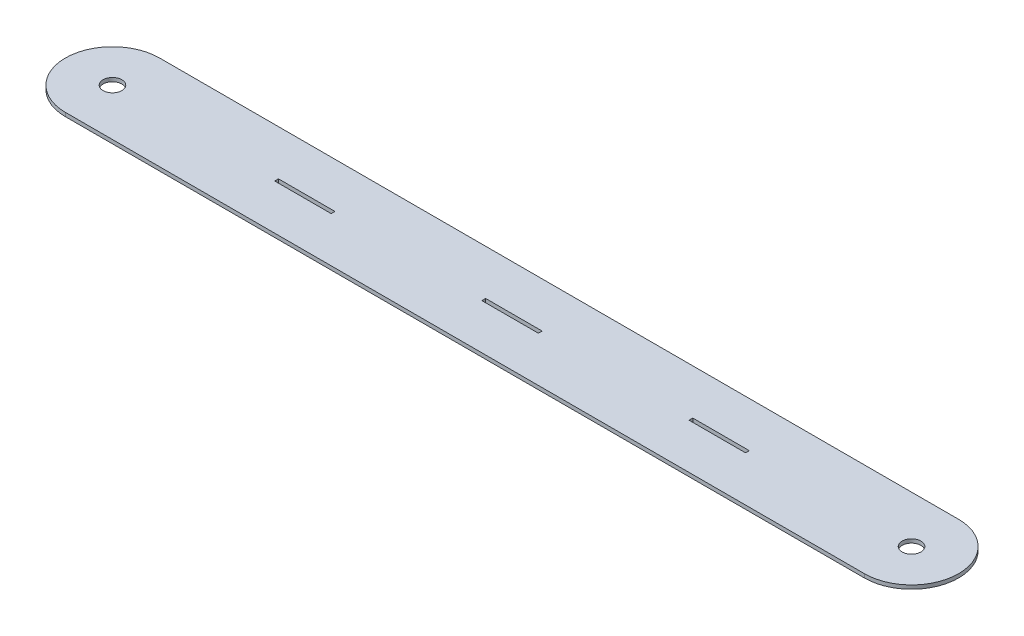
ISO-10303-21;
HEADER;
FILE_DESCRIPTION(('STEP AP214'),'2;1');
FILE_NAME('part.step','',(''),(''),'','','');
FILE_SCHEMA(('AUTOMOTIVE_DESIGN { 1 0 10303 214 1 1 1 1 }'));
ENDSEC;
DATA;
#1=APPLICATION_CONTEXT('core data for automotive mechanical design processes');
#2=APPLICATION_PROTOCOL_DEFINITION('international standard','automotive_design',2000,#1);
#3=PRODUCT_CONTEXT('',#1,'mechanical');
#4=PRODUCT('Part','Part','',(#3));
#5=PRODUCT_RELATED_PRODUCT_CATEGORY('part','',(#4));
#6=PRODUCT_DEFINITION_FORMATION('','',#4);
#7=PRODUCT_DEFINITION_CONTEXT('part definition',#1,'design');
#8=PRODUCT_DEFINITION('design','',#6,#7);
#9=PRODUCT_DEFINITION_SHAPE('','',#8);
#10=(LENGTH_UNIT() NAMED_UNIT(*) SI_UNIT(.MILLI.,.METRE.));
#11=(NAMED_UNIT(*) PLANE_ANGLE_UNIT() SI_UNIT($,.RADIAN.));
#12=(NAMED_UNIT(*) SI_UNIT($,.STERADIAN.) SOLID_ANGLE_UNIT());
#13=UNCERTAINTY_MEASURE_WITH_UNIT(LENGTH_MEASURE(1.E-05),#10,'distance_accuracy_value','');
#14=(GEOMETRIC_REPRESENTATION_CONTEXT(3) GLOBAL_UNCERTAINTY_ASSIGNED_CONTEXT((#13)) GLOBAL_UNIT_ASSIGNED_CONTEXT((#10,
#11,#12)) REPRESENTATION_CONTEXT('',''));
#15=CARTESIAN_POINT('',(0.,0.,0.));
#16=DIRECTION('',(0.,0.,1.));
#17=DIRECTION('',(1.,0.,0.));
#18=AXIS2_PLACEMENT_3D('',#15,#16,#17);
#19=CARTESIAN_POINT('',(0.,1.,0.));
#20=DIRECTION('',(0.,1.,0.));
#21=DIRECTION('',(0.,0.,1.));
#22=AXIS2_PLACEMENT_3D('',#19,#20,#21);
#23=PLANE('',#22);
#24=CARTESIAN_POINT('',(0.,1.,0.));
#25=DIRECTION('',(0.,1.,0.));
#26=DIRECTION('',(0.,0.,1.));
#27=AXIS2_PLACEMENT_3D('',#24,#25,#26);
#28=CIRCLE('',#27,2.5);
#29=CARTESIAN_POINT('',(0.,1.,2.5));
#30=VERTEX_POINT('',#29);
#31=EDGE_CURVE('E250',#30,#30,#28,.T.);
#32=ORIENTED_EDGE('',*,*,#31,.F.);
#33=EDGE_LOOP('',(#32));
#34=FACE_BOUND('',#33,.T.);
#35=CARTESIAN_POINT('',(0.,1.,0.));
#36=DIRECTION('',(0.,1.,0.));
#37=DIRECTION('',(0.,0.,1.));
#38=AXIS2_PLACEMENT_3D('',#35,#36,#37);
#39=CIRCLE('',#38,12.5);
#40=CARTESIAN_POINT('',(0.,1.,-12.5));
#41=VERTEX_POINT('',#40);
#42=CARTESIAN_POINT('',(0.,1.,12.5));
#43=VERTEX_POINT('',#42);
#44=EDGE_CURVE('E256',#41,#43,#39,.T.);
#45=ORIENTED_EDGE('',*,*,#44,.T.);
#46=DIRECTION('',(1.,0.,0.));
#47=VECTOR('',#46,1.);
#48=CARTESIAN_POINT('',(0.,1.,12.5));
#49=LINE('',#48,#47);
#50=CARTESIAN_POINT('',(212.132034355964,1.,12.5));
#51=VERTEX_POINT('',#50);
#52=EDGE_CURVE('E259',#43,#51,#49,.T.);
#53=ORIENTED_EDGE('',*,*,#52,.T.);
#54=CARTESIAN_POINT('',(212.132034355964,1.,0.));
#55=DIRECTION('',(0.,1.,0.));
#56=DIRECTION('',(0.,0.,1.));
#57=AXIS2_PLACEMENT_3D('',#54,#55,#56);
#58=CIRCLE('',#57,12.5);
#59=CARTESIAN_POINT('',(212.132034355964,1.,-12.5));
#60=VERTEX_POINT('',#59);
#61=EDGE_CURVE('E262',#51,#60,#58,.T.);
#62=ORIENTED_EDGE('',*,*,#61,.T.);
#63=DIRECTION('',(-1.,0.,0.));
#64=VECTOR('',#63,1.);
#65=CARTESIAN_POINT('',(0.,1.,-12.5));
#66=LINE('',#65,#64);
#67=EDGE_CURVE('E264',#60,#41,#66,.T.);
#68=ORIENTED_EDGE('',*,*,#67,.T.);
#69=EDGE_LOOP('',(#45,#53,#62,#68));
#70=FACE_BOUND('',#69,.T.);
#71=CARTESIAN_POINT('',(212.132034355964,1.,0.));
#72=DIRECTION('',(0.,1.,0.));
#73=DIRECTION('',(0.,0.,1.));
#74=AXIS2_PLACEMENT_3D('',#71,#72,#73);
#75=CIRCLE('',#74,2.50000000000002);
#76=CARTESIAN_POINT('',(212.132034355964,1.,2.50000000000002));
#77=VERTEX_POINT('',#76);
#78=EDGE_CURVE('E244',#77,#77,#75,.T.);
#79=ORIENTED_EDGE('',*,*,#78,.F.);
#80=EDGE_LOOP('',(#79));
#81=FACE_BOUND('',#80,.T.);
#82=DIRECTION('',(-1.,0.,0.));
#83=VECTOR('',#82,1.);
#84=CARTESIAN_POINT('',(98.5660171779821,1.,-0.5));
#85=LINE('',#84,#83);
#86=CARTESIAN_POINT('',(113.566017177982,1.,-0.5));
#87=VERTEX_POINT('',#86);
#88=CARTESIAN_POINT('',(98.5660171779821,1.,-0.5));
#89=VERTEX_POINT('',#88);
#90=EDGE_CURVE('E215',#87,#89,#85,.T.);
#91=ORIENTED_EDGE('',*,*,#90,.F.);
#92=DIRECTION('',(0.,0.,-1.));
#93=VECTOR('',#92,1.);
#94=CARTESIAN_POINT('',(113.566017177982,1.,0.5));
#95=LINE('',#94,#93);
#96=CARTESIAN_POINT('',(113.566017177982,1.,0.5));
#97=VERTEX_POINT('',#96);
#98=EDGE_CURVE('E213',#97,#87,#95,.T.);
#99=ORIENTED_EDGE('',*,*,#98,.F.);
#100=DIRECTION('',(1.,0.,0.));
#101=VECTOR('',#100,1.);
#102=CARTESIAN_POINT('',(98.5660171779821,1.,0.5));
#103=LINE('',#102,#101);
#104=CARTESIAN_POINT('',(98.5660171779821,1.,0.5));
#105=VERTEX_POINT('',#104);
#106=EDGE_CURVE('E221',#105,#97,#103,.T.);
#107=ORIENTED_EDGE('',*,*,#106,.F.);
#108=DIRECTION('',(0.,0.,1.));
#109=VECTOR('',#108,1.);
#110=CARTESIAN_POINT('',(98.5660171779821,1.,0.5));
#111=LINE('',#110,#109);
#112=EDGE_CURVE('E218',#89,#105,#111,.T.);
#113=ORIENTED_EDGE('',*,*,#112,.F.);
#114=EDGE_LOOP('',(#91,#99,#107,#113));
#115=FACE_BOUND('',#114,.T.);
#116=DIRECTION('',(-1.,0.,0.));
#117=VECTOR('',#116,1.);
#118=CARTESIAN_POINT('',(43.5660171779821,1.,-0.5));
#119=LINE('',#118,#117);
#120=CARTESIAN_POINT('',(58.5660171779821,1.,-0.5));
#121=VERTEX_POINT('',#120);
#122=CARTESIAN_POINT('',(43.5660171779821,1.,-0.5));
#123=VERTEX_POINT('',#122);
#124=EDGE_CURVE('E184',#121,#123,#119,.T.);
#125=ORIENTED_EDGE('',*,*,#124,.F.);
#126=DIRECTION('',(0.,0.,-1.));
#127=VECTOR('',#126,1.);
#128=CARTESIAN_POINT('',(58.5660171779821,1.,0.5));
#129=LINE('',#128,#127);
#130=CARTESIAN_POINT('',(58.5660171779821,1.,0.5));
#131=VERTEX_POINT('',#130);
#132=EDGE_CURVE('E182',#131,#121,#129,.T.);
#133=ORIENTED_EDGE('',*,*,#132,.F.);
#134=DIRECTION('',(1.,0.,0.));
#135=VECTOR('',#134,1.);
#136=CARTESIAN_POINT('',(43.5660171779821,1.,0.5));
#137=LINE('',#136,#135);
#138=CARTESIAN_POINT('',(43.5660171779821,1.,0.5));
#139=VERTEX_POINT('',#138);
#140=EDGE_CURVE('E190',#139,#131,#137,.T.);
#141=ORIENTED_EDGE('',*,*,#140,.F.);
#142=DIRECTION('',(0.,0.,1.));
#143=VECTOR('',#142,1.);
#144=CARTESIAN_POINT('',(43.5660171779821,1.,0.5));
#145=LINE('',#144,#143);
#146=EDGE_CURVE('E187',#123,#139,#145,.T.);
#147=ORIENTED_EDGE('',*,*,#146,.F.);
#148=EDGE_LOOP('',(#125,#133,#141,#147));
#149=FACE_BOUND('',#148,.T.);
#150=DIRECTION('',(-1.,0.,0.));
#151=VECTOR('',#150,1.);
#152=CARTESIAN_POINT('',(153.566017177982,1.,-0.5));
#153=LINE('',#152,#151);
#154=CARTESIAN_POINT('',(168.566017177982,1.,-0.5));
#155=VERTEX_POINT('',#154);
#156=CARTESIAN_POINT('',(153.566017177982,1.,-0.5));
#157=VERTEX_POINT('',#156);
#158=EDGE_CURVE('E154',#155,#157,#153,.T.);
#159=ORIENTED_EDGE('',*,*,#158,.F.);
#160=DIRECTION('',(0.,0.,-1.));
#161=VECTOR('',#160,1.);
#162=CARTESIAN_POINT('',(168.566017177982,1.,0.5));
#163=LINE('',#162,#161);
#164=CARTESIAN_POINT('',(168.566017177982,1.,0.5));
#165=VERTEX_POINT('',#164);
#166=EDGE_CURVE('E146',#165,#155,#163,.T.);
#167=ORIENTED_EDGE('',*,*,#166,.F.);
#168=DIRECTION('',(1.,0.,0.));
#169=VECTOR('',#168,1.);
#170=CARTESIAN_POINT('',(153.566017177982,1.,0.5));
#171=LINE('',#170,#169);
#172=CARTESIAN_POINT('',(153.566017177982,1.,0.5));
#173=VERTEX_POINT('',#172);
#174=EDGE_CURVE('E168',#173,#165,#171,.T.);
#175=ORIENTED_EDGE('',*,*,#174,.F.);
#176=DIRECTION('',(0.,0.,1.));
#177=VECTOR('',#176,1.);
#178=CARTESIAN_POINT('',(153.566017177982,1.,0.5));
#179=LINE('',#178,#177);
#180=EDGE_CURVE('E166',#157,#173,#179,.T.);
#181=ORIENTED_EDGE('',*,*,#180,.F.);
#182=EDGE_LOOP('',(#159,#167,#175,#181));
#183=FACE_BOUND('',#182,.T.);
#184=ADVANCED_FACE('F33',(#34,#70,#81,#115,#149,#183),#23,.T.);
#185=CARTESIAN_POINT('',(0.,0.,0.));
#186=DIRECTION('',(0.,1.,0.));
#187=DIRECTION('',(0.,0.,1.));
#188=AXIS2_PLACEMENT_3D('',#185,#186,#187);
#189=PLANE('',#188);
#190=DIRECTION('',(0.,0.,-1.));
#191=VECTOR('',#190,1.);
#192=CARTESIAN_POINT('',(58.5660171779821,0.,0.5));
#193=LINE('',#192,#191);
#194=CARTESIAN_POINT('',(58.5660171779821,0.,0.5));
#195=VERTEX_POINT('',#194);
#196=CARTESIAN_POINT('',(58.5660171779821,0.,-0.5));
#197=VERTEX_POINT('',#196);
#198=EDGE_CURVE('E162',#195,#197,#193,.T.);
#199=ORIENTED_EDGE('',*,*,#198,.T.);
#200=DIRECTION('',(-1.,0.,0.));
#201=VECTOR('',#200,1.);
#202=CARTESIAN_POINT('',(43.5660171779821,0.,-0.5));
#203=LINE('',#202,#201);
#204=CARTESIAN_POINT('',(43.5660171779821,0.,-0.5));
#205=VERTEX_POINT('',#204);
#206=EDGE_CURVE('E195',#197,#205,#203,.T.);
#207=ORIENTED_EDGE('',*,*,#206,.T.);
#208=DIRECTION('',(0.,0.,1.));
#209=VECTOR('',#208,1.);
#210=CARTESIAN_POINT('',(43.5660171779821,0.,0.5));
#211=LINE('',#210,#209);
#212=CARTESIAN_POINT('',(43.5660171779821,0.,0.5));
#213=VERTEX_POINT('',#212);
#214=EDGE_CURVE('E198',#205,#213,#211,.T.);
#215=ORIENTED_EDGE('',*,*,#214,.T.);
#216=DIRECTION('',(1.,0.,0.));
#217=VECTOR('',#216,1.);
#218=CARTESIAN_POINT('',(43.5660171779821,0.,0.5));
#219=LINE('',#218,#217);
#220=EDGE_CURVE('E185',#213,#195,#219,.T.);
#221=ORIENTED_EDGE('',*,*,#220,.T.);
#222=EDGE_LOOP('',(#199,#207,#215,#221));
#223=FACE_BOUND('',#222,.T.);
#224=CARTESIAN_POINT('',(212.132034355964,0.,0.));
#225=DIRECTION('',(0.,1.,0.));
#226=DIRECTION('',(0.,0.,1.));
#227=AXIS2_PLACEMENT_3D('',#224,#225,#226);
#228=CIRCLE('',#227,2.50000000000002);
#229=CARTESIAN_POINT('',(212.132034355964,0.,2.50000000000002));
#230=VERTEX_POINT('',#229);
#231=EDGE_CURVE('E243',#230,#230,#228,.T.);
#232=ORIENTED_EDGE('',*,*,#231,.T.);
#233=EDGE_LOOP('',(#232));
#234=FACE_BOUND('',#233,.T.);
#235=CARTESIAN_POINT('',(0.,0.,0.));
#236=DIRECTION('',(0.,1.,0.));
#237=DIRECTION('',(0.,0.,1.));
#238=AXIS2_PLACEMENT_3D('',#235,#236,#237);
#239=CIRCLE('',#238,2.5);
#240=CARTESIAN_POINT('',(0.,0.,2.5));
#241=VERTEX_POINT('',#240);
#242=EDGE_CURVE('E247',#241,#241,#239,.T.);
#243=ORIENTED_EDGE('',*,*,#242,.T.);
#244=EDGE_LOOP('',(#243));
#245=FACE_BOUND('',#244,.T.);
#246=CARTESIAN_POINT('',(0.,0.,0.));
#247=DIRECTION('',(0.,1.,0.));
#248=DIRECTION('',(0.,0.,1.));
#249=AXIS2_PLACEMENT_3D('',#246,#247,#248);
#250=CIRCLE('',#249,12.5);
#251=CARTESIAN_POINT('',(0.,0.,-12.5));
#252=VERTEX_POINT('',#251);
#253=CARTESIAN_POINT('',(0.,0.,12.5));
#254=VERTEX_POINT('',#253);
#255=EDGE_CURVE('E253',#252,#254,#250,.T.);
#256=ORIENTED_EDGE('',*,*,#255,.F.);
#257=DIRECTION('',(-1.,0.,0.));
#258=VECTOR('',#257,1.);
#259=CARTESIAN_POINT('',(0.,0.,-12.5));
#260=LINE('',#259,#258);
#261=CARTESIAN_POINT('',(212.132034355964,0.,-12.5));
#262=VERTEX_POINT('',#261);
#263=EDGE_CURVE('E260',#262,#252,#260,.T.);
#264=ORIENTED_EDGE('',*,*,#263,.F.);
#265=CARTESIAN_POINT('',(212.132034355964,0.,0.));
#266=DIRECTION('',(0.,1.,0.));
#267=DIRECTION('',(0.,0.,1.));
#268=AXIS2_PLACEMENT_3D('',#265,#266,#267);
#269=CIRCLE('',#268,12.5);
#270=CARTESIAN_POINT('',(212.132034355964,0.,12.5));
#271=VERTEX_POINT('',#270);
#272=EDGE_CURVE('E271',#271,#262,#269,.T.);
#273=ORIENTED_EDGE('',*,*,#272,.F.);
#274=DIRECTION('',(1.,0.,0.));
#275=VECTOR('',#274,1.);
#276=CARTESIAN_POINT('',(0.,0.,12.5));
#277=LINE('',#276,#275);
#278=EDGE_CURVE('E269',#254,#271,#277,.T.);
#279=ORIENTED_EDGE('',*,*,#278,.F.);
#280=EDGE_LOOP('',(#256,#264,#273,#279));
#281=FACE_BOUND('',#280,.T.);
#282=DIRECTION('',(0.,0.,-1.));
#283=VECTOR('',#282,1.);
#284=CARTESIAN_POINT('',(113.566017177982,0.,0.5));
#285=LINE('',#284,#283);
#286=CARTESIAN_POINT('',(113.566017177982,0.,0.5));
#287=VERTEX_POINT('',#286);
#288=CARTESIAN_POINT('',(113.566017177982,0.,-0.5));
#289=VERTEX_POINT('',#288);
#290=EDGE_CURVE('E212',#287,#289,#285,.T.);
#291=ORIENTED_EDGE('',*,*,#290,.T.);
#292=DIRECTION('',(-1.,0.,0.));
#293=VECTOR('',#292,1.);
#294=CARTESIAN_POINT('',(98.5660171779821,0.,-0.5));
#295=LINE('',#294,#293);
#296=CARTESIAN_POINT('',(98.5660171779821,0.,-0.5));
#297=VERTEX_POINT('',#296);
#298=EDGE_CURVE('E226',#289,#297,#295,.T.);
#299=ORIENTED_EDGE('',*,*,#298,.T.);
#300=DIRECTION('',(0.,0.,1.));
#301=VECTOR('',#300,1.);
#302=CARTESIAN_POINT('',(98.5660171779821,0.,0.5));
#303=LINE('',#302,#301);
#304=CARTESIAN_POINT('',(98.5660171779821,0.,0.5));
#305=VERTEX_POINT('',#304);
#306=EDGE_CURVE('E229',#297,#305,#303,.T.);
#307=ORIENTED_EDGE('',*,*,#306,.T.);
#308=DIRECTION('',(1.,0.,0.));
#309=VECTOR('',#308,1.);
#310=CARTESIAN_POINT('',(98.5660171779821,0.,0.5));
#311=LINE('',#310,#309);
#312=EDGE_CURVE('E216',#305,#287,#311,.T.);
#313=ORIENTED_EDGE('',*,*,#312,.T.);
#314=EDGE_LOOP('',(#291,#299,#307,#313));
#315=FACE_BOUND('',#314,.T.);
#316=DIRECTION('',(0.,0.,-1.));
#317=VECTOR('',#316,1.);
#318=CARTESIAN_POINT('',(168.566017177982,0.,0.5));
#319=LINE('',#318,#317);
#320=CARTESIAN_POINT('',(168.566017177982,0.,0.5));
#321=VERTEX_POINT('',#320);
#322=CARTESIAN_POINT('',(168.566017177982,0.,-0.5));
#323=VERTEX_POINT('',#322);
#324=EDGE_CURVE('E56',#321,#323,#319,.T.);
#325=ORIENTED_EDGE('',*,*,#324,.T.);
#326=DIRECTION('',(-1.,0.,0.));
#327=VECTOR('',#326,1.);
#328=CARTESIAN_POINT('',(153.566017177982,0.,-0.5));
#329=LINE('',#328,#327);
#330=CARTESIAN_POINT('',(153.566017177982,0.,-0.5));
#331=VERTEX_POINT('',#330);
#332=EDGE_CURVE('E161',#323,#331,#329,.T.);
#333=ORIENTED_EDGE('',*,*,#332,.T.);
#334=DIRECTION('',(0.,0.,1.));
#335=VECTOR('',#334,1.);
#336=CARTESIAN_POINT('',(153.566017177982,0.,0.5));
#337=LINE('',#336,#335);
#338=CARTESIAN_POINT('',(153.566017177982,0.,0.5));
#339=VERTEX_POINT('',#338);
#340=EDGE_CURVE('E174',#331,#339,#337,.T.);
#341=ORIENTED_EDGE('',*,*,#340,.T.);
#342=DIRECTION('',(1.,0.,0.));
#343=VECTOR('',#342,1.);
#344=CARTESIAN_POINT('',(153.566017177982,0.,0.5));
#345=LINE('',#344,#343);
#346=EDGE_CURVE('E155',#339,#321,#345,.T.);
#347=ORIENTED_EDGE('',*,*,#346,.T.);
#348=EDGE_LOOP('',(#325,#333,#341,#347));
#349=FACE_BOUND('',#348,.T.);
#350=ADVANCED_FACE('F289',(#223,#234,#245,#281,#315,#349),#189,.F.);
#351=CARTESIAN_POINT('',(0.,1.,0.));
#352=DIRECTION('',(0.,-1.,0.));
#353=DIRECTION('',(0.,0.,-1.));
#354=AXIS2_PLACEMENT_3D('',#351,#352,#353);
#355=CYLINDRICAL_SURFACE('',#354,12.5);
#356=ORIENTED_EDGE('',*,*,#255,.T.);
#357=DIRECTION('',(0.,-1.,0.));
#358=VECTOR('',#357,1.);
#359=CARTESIAN_POINT('',(0.,1.,12.5));
#360=LINE('',#359,#358);
#361=EDGE_CURVE('E11',#43,#254,#360,.T.);
#362=ORIENTED_EDGE('',*,*,#361,.F.);
#363=ORIENTED_EDGE('',*,*,#44,.F.);
#364=DIRECTION('',(0.,-1.,0.));
#365=VECTOR('',#364,1.);
#366=CARTESIAN_POINT('',(0.,1.,-12.5));
#367=LINE('',#366,#365);
#368=EDGE_CURVE('E266',#41,#252,#367,.T.);
#369=ORIENTED_EDGE('',*,*,#368,.T.);
#370=EDGE_LOOP('',(#356,#362,#363,#369));
#371=FACE_BOUND('',#370,.T.);
#372=ADVANCED_FACE('F35',(#371),#355,.T.);
#373=CARTESIAN_POINT('',(0.,1.,12.5));
#374=DIRECTION('',(0.,0.,-1.));
#375=DIRECTION('',(-1.,0.,0.));
#376=AXIS2_PLACEMENT_3D('',#373,#374,#375);
#377=PLANE('',#376);
#378=ORIENTED_EDGE('',*,*,#278,.T.);
#379=DIRECTION('',(0.,-1.,0.));
#380=VECTOR('',#379,1.);
#381=CARTESIAN_POINT('',(212.132034355964,1.,12.5));
#382=LINE('',#381,#380);
#383=EDGE_CURVE('E41',#51,#271,#382,.T.);
#384=ORIENTED_EDGE('',*,*,#383,.F.);
#385=ORIENTED_EDGE('',*,*,#52,.F.);
#386=ORIENTED_EDGE('',*,*,#361,.T.);
#387=EDGE_LOOP('',(#378,#384,#385,#386));
#388=FACE_BOUND('',#387,.T.);
#389=ADVANCED_FACE('F300',(#388),#377,.F.);
#390=CARTESIAN_POINT('',(212.132034355964,1.,0.));
#391=DIRECTION('',(0.,-1.,0.));
#392=DIRECTION('',(0.,0.,-1.));
#393=AXIS2_PLACEMENT_3D('',#390,#391,#392);
#394=CYLINDRICAL_SURFACE('',#393,12.5);
#395=ORIENTED_EDGE('',*,*,#272,.T.);
#396=DIRECTION('',(0.,-1.,0.));
#397=VECTOR('',#396,1.);
#398=CARTESIAN_POINT('',(212.132034355964,1.,-12.5));
#399=LINE('',#398,#397);
#400=EDGE_CURVE('E276',#60,#262,#399,.T.);
#401=ORIENTED_EDGE('',*,*,#400,.F.);
#402=ORIENTED_EDGE('',*,*,#61,.F.);
#403=ORIENTED_EDGE('',*,*,#383,.T.);
#404=EDGE_LOOP('',(#395,#401,#402,#403));
#405=FACE_BOUND('',#404,.T.);
#406=ADVANCED_FACE('F283',(#405),#394,.T.);
#407=CARTESIAN_POINT('',(0.,1.,-12.5));
#408=DIRECTION('',(0.,0.,1.));
#409=DIRECTION('',(1.,0.,0.));
#410=AXIS2_PLACEMENT_3D('',#407,#408,#409);
#411=PLANE('',#410);
#412=ORIENTED_EDGE('',*,*,#263,.T.);
#413=ORIENTED_EDGE('',*,*,#368,.F.);
#414=ORIENTED_EDGE('',*,*,#67,.F.);
#415=ORIENTED_EDGE('',*,*,#400,.T.);
#416=EDGE_LOOP('',(#412,#413,#414,#415));
#417=FACE_BOUND('',#416,.T.);
#418=ADVANCED_FACE('F293',(#417),#411,.F.);
#419=CARTESIAN_POINT('',(0.,1.,0.));
#420=DIRECTION('',(0.,-1.,0.));
#421=DIRECTION('',(0.,0.,-1.));
#422=AXIS2_PLACEMENT_3D('',#419,#420,#421);
#423=CYLINDRICAL_SURFACE('',#422,2.5);
#424=ORIENTED_EDGE('',*,*,#31,.T.);
#425=EDGE_LOOP('',(#424));
#426=FACE_BOUND('',#425,.T.);
#427=ORIENTED_EDGE('',*,*,#242,.F.);
#428=EDGE_LOOP('',(#427));
#429=FACE_BOUND('',#428,.T.);
#430=ADVANCED_FACE('F317',(#426,#429),#423,.F.);
#431=CARTESIAN_POINT('',(212.132034355964,1.,0.));
#432=DIRECTION('',(0.,-1.,0.));
#433=DIRECTION('',(0.,0.,-1.));
#434=AXIS2_PLACEMENT_3D('',#431,#432,#433);
#435=CYLINDRICAL_SURFACE('',#434,2.50000000000002);
#436=ORIENTED_EDGE('',*,*,#78,.T.);
#437=EDGE_LOOP('',(#436));
#438=FACE_BOUND('',#437,.T.);
#439=ORIENTED_EDGE('',*,*,#231,.F.);
#440=EDGE_LOOP('',(#439));
#441=FACE_BOUND('',#440,.T.);
#442=ADVANCED_FACE('F324',(#438,#441),#435,.F.);
#443=CARTESIAN_POINT('',(113.566017177982,1.,0.5));
#444=DIRECTION('',(-1.,0.,0.));
#445=DIRECTION('',(0.,0.,1.));
#446=AXIS2_PLACEMENT_3D('',#443,#444,#445);
#447=PLANE('',#446);
#448=ORIENTED_EDGE('',*,*,#290,.F.);
#449=DIRECTION('',(0.,-1.,0.));
#450=VECTOR('',#449,1.);
#451=CARTESIAN_POINT('',(113.566017177982,1.,0.5));
#452=LINE('',#451,#450);
#453=EDGE_CURVE('E223',#97,#287,#452,.T.);
#454=ORIENTED_EDGE('',*,*,#453,.F.);
#455=ORIENTED_EDGE('',*,*,#98,.T.);
#456=DIRECTION('',(0.,-1.,0.));
#457=VECTOR('',#456,1.);
#458=CARTESIAN_POINT('',(113.566017177982,1.,-0.5));
#459=LINE('',#458,#457);
#460=EDGE_CURVE('E240',#87,#289,#459,.T.);
#461=ORIENTED_EDGE('',*,*,#460,.T.);
#462=EDGE_LOOP('',(#448,#454,#455,#461));
#463=FACE_BOUND('',#462,.T.);
#464=ADVANCED_FACE('F329',(#463),#447,.T.);
#465=CARTESIAN_POINT('',(98.5660171779821,1.,-0.5));
#466=DIRECTION('',(0.,0.,1.));
#467=DIRECTION('',(1.,0.,0.));
#468=AXIS2_PLACEMENT_3D('',#465,#466,#467);
#469=PLANE('',#468);
#470=ORIENTED_EDGE('',*,*,#298,.F.);
#471=ORIENTED_EDGE('',*,*,#460,.F.);
#472=ORIENTED_EDGE('',*,*,#90,.T.);
#473=DIRECTION('',(0.,-1.,0.));
#474=VECTOR('',#473,1.);
#475=CARTESIAN_POINT('',(98.5660171779821,1.,-0.5));
#476=LINE('',#475,#474);
#477=EDGE_CURVE('E238',#89,#297,#476,.T.);
#478=ORIENTED_EDGE('',*,*,#477,.T.);
#479=EDGE_LOOP('',(#470,#471,#472,#478));
#480=FACE_BOUND('',#479,.T.);
#481=ADVANCED_FACE('F337',(#480),#469,.T.);
#482=CARTESIAN_POINT('',(98.5660171779821,1.,0.5));
#483=DIRECTION('',(1.,0.,0.));
#484=DIRECTION('',(0.,0.,-1.));
#485=AXIS2_PLACEMENT_3D('',#482,#483,#484);
#486=PLANE('',#485);
#487=ORIENTED_EDGE('',*,*,#306,.F.);
#488=ORIENTED_EDGE('',*,*,#477,.F.);
#489=ORIENTED_EDGE('',*,*,#112,.T.);
#490=DIRECTION('',(0.,-1.,0.));
#491=VECTOR('',#490,1.);
#492=CARTESIAN_POINT('',(98.5660171779821,1.,0.5));
#493=LINE('',#492,#491);
#494=EDGE_CURVE('E236',#105,#305,#493,.T.);
#495=ORIENTED_EDGE('',*,*,#494,.T.);
#496=EDGE_LOOP('',(#487,#488,#489,#495));
#497=FACE_BOUND('',#496,.T.);
#498=ADVANCED_FACE('F344',(#497),#486,.T.);
#499=CARTESIAN_POINT('',(98.5660171779821,1.,0.5));
#500=DIRECTION('',(0.,0.,-1.));
#501=DIRECTION('',(-1.,0.,0.));
#502=AXIS2_PLACEMENT_3D('',#499,#500,#501);
#503=PLANE('',#502);
#504=ORIENTED_EDGE('',*,*,#312,.F.);
#505=ORIENTED_EDGE('',*,*,#494,.F.);
#506=ORIENTED_EDGE('',*,*,#106,.T.);
#507=ORIENTED_EDGE('',*,*,#453,.T.);
#508=EDGE_LOOP('',(#504,#505,#506,#507));
#509=FACE_BOUND('',#508,.T.);
#510=ADVANCED_FACE('F348',(#509),#503,.T.);
#511=CARTESIAN_POINT('',(58.5660171779821,1.,0.5));
#512=DIRECTION('',(-1.,0.,0.));
#513=DIRECTION('',(0.,0.,1.));
#514=AXIS2_PLACEMENT_3D('',#511,#512,#513);
#515=PLANE('',#514);
#516=ORIENTED_EDGE('',*,*,#198,.F.);
#517=DIRECTION('',(0.,-1.,0.));
#518=VECTOR('',#517,1.);
#519=CARTESIAN_POINT('',(58.5660171779821,1.,0.5));
#520=LINE('',#519,#518);
#521=EDGE_CURVE('E192',#131,#195,#520,.T.);
#522=ORIENTED_EDGE('',*,*,#521,.F.);
#523=ORIENTED_EDGE('',*,*,#132,.T.);
#524=DIRECTION('',(0.,-1.,0.));
#525=VECTOR('',#524,1.);
#526=CARTESIAN_POINT('',(58.5660171779821,1.,-0.5));
#527=LINE('',#526,#525);
#528=EDGE_CURVE('E209',#121,#197,#527,.T.);
#529=ORIENTED_EDGE('',*,*,#528,.T.);
#530=EDGE_LOOP('',(#516,#522,#523,#529));
#531=FACE_BOUND('',#530,.T.);
#532=ADVANCED_FACE('F352',(#531),#515,.T.);
#533=CARTESIAN_POINT('',(43.5660171779821,1.,-0.5));
#534=DIRECTION('',(0.,0.,1.));
#535=DIRECTION('',(1.,0.,0.));
#536=AXIS2_PLACEMENT_3D('',#533,#534,#535);
#537=PLANE('',#536);
#538=ORIENTED_EDGE('',*,*,#206,.F.);
#539=ORIENTED_EDGE('',*,*,#528,.F.);
#540=ORIENTED_EDGE('',*,*,#124,.T.);
#541=DIRECTION('',(0.,-1.,0.));
#542=VECTOR('',#541,1.);
#543=CARTESIAN_POINT('',(43.5660171779821,1.,-0.5));
#544=LINE('',#543,#542);
#545=EDGE_CURVE('E207',#123,#205,#544,.T.);
#546=ORIENTED_EDGE('',*,*,#545,.T.);
#547=EDGE_LOOP('',(#538,#539,#540,#546));
#548=FACE_BOUND('',#547,.T.);
#549=ADVANCED_FACE('F356',(#548),#537,.T.);
#550=CARTESIAN_POINT('',(43.5660171779821,1.,0.5));
#551=DIRECTION('',(1.,0.,0.));
#552=DIRECTION('',(0.,0.,-1.));
#553=AXIS2_PLACEMENT_3D('',#550,#551,#552);
#554=PLANE('',#553);
#555=ORIENTED_EDGE('',*,*,#214,.F.);
#556=ORIENTED_EDGE('',*,*,#545,.F.);
#557=ORIENTED_EDGE('',*,*,#146,.T.);
#558=DIRECTION('',(0.,-1.,0.));
#559=VECTOR('',#558,1.);
#560=CARTESIAN_POINT('',(43.5660171779821,1.,0.5));
#561=LINE('',#560,#559);
#562=EDGE_CURVE('E205',#139,#213,#561,.T.);
#563=ORIENTED_EDGE('',*,*,#562,.T.);
#564=EDGE_LOOP('',(#555,#556,#557,#563));
#565=FACE_BOUND('',#564,.T.);
#566=ADVANCED_FACE('F360',(#565),#554,.T.);
#567=CARTESIAN_POINT('',(43.5660171779821,1.,0.5));
#568=DIRECTION('',(0.,0.,-1.));
#569=DIRECTION('',(-1.,0.,0.));
#570=AXIS2_PLACEMENT_3D('',#567,#568,#569);
#571=PLANE('',#570);
#572=ORIENTED_EDGE('',*,*,#220,.F.);
#573=ORIENTED_EDGE('',*,*,#562,.F.);
#574=ORIENTED_EDGE('',*,*,#140,.T.);
#575=ORIENTED_EDGE('',*,*,#521,.T.);
#576=EDGE_LOOP('',(#572,#573,#574,#575));
#577=FACE_BOUND('',#576,.T.);
#578=ADVANCED_FACE('F364',(#577),#571,.T.);
#579=CARTESIAN_POINT('',(168.566017177982,1.,0.5));
#580=DIRECTION('',(-1.,0.,0.));
#581=DIRECTION('',(0.,0.,1.));
#582=AXIS2_PLACEMENT_3D('',#579,#580,#581);
#583=PLANE('',#582);
#584=ORIENTED_EDGE('',*,*,#324,.F.);
#585=DIRECTION('',(0.,-1.,0.));
#586=VECTOR('',#585,1.);
#587=CARTESIAN_POINT('',(168.566017177982,1.,0.5));
#588=LINE('',#587,#586);
#589=EDGE_CURVE('E150',#165,#321,#588,.T.);
#590=ORIENTED_EDGE('',*,*,#589,.F.);
#591=ORIENTED_EDGE('',*,*,#166,.T.);
#592=DIRECTION('',(0.,-1.,0.));
#593=VECTOR('',#592,1.);
#594=CARTESIAN_POINT('',(168.566017177982,1.,-0.5));
#595=LINE('',#594,#593);
#596=EDGE_CURVE('E149',#155,#323,#595,.T.);
#597=ORIENTED_EDGE('',*,*,#596,.T.);
#598=EDGE_LOOP('',(#584,#590,#591,#597));
#599=FACE_BOUND('',#598,.T.);
#600=ADVANCED_FACE('F148',(#599),#583,.T.);
#601=CARTESIAN_POINT('',(153.566017177982,1.,-0.5));
#602=DIRECTION('',(0.,0.,1.));
#603=DIRECTION('',(1.,0.,0.));
#604=AXIS2_PLACEMENT_3D('',#601,#602,#603);
#605=PLANE('',#604);
#606=ORIENTED_EDGE('',*,*,#332,.F.);
#607=ORIENTED_EDGE('',*,*,#596,.F.);
#608=ORIENTED_EDGE('',*,*,#158,.T.);
#609=DIRECTION('',(0.,-1.,0.));
#610=VECTOR('',#609,1.);
#611=CARTESIAN_POINT('',(153.566017177982,1.,-0.5));
#612=LINE('',#611,#610);
#613=EDGE_CURVE('E163',#157,#331,#612,.T.);
#614=ORIENTED_EDGE('',*,*,#613,.T.);
#615=EDGE_LOOP('',(#606,#607,#608,#614));
#616=FACE_BOUND('',#615,.T.);
#617=ADVANCED_FACE('F158',(#616),#605,.T.);
#618=CARTESIAN_POINT('',(153.566017177982,1.,0.5));
#619=DIRECTION('',(1.,0.,0.));
#620=DIRECTION('',(0.,0.,-1.));
#621=AXIS2_PLACEMENT_3D('',#618,#619,#620);
#622=PLANE('',#621);
#623=ORIENTED_EDGE('',*,*,#340,.F.);
#624=ORIENTED_EDGE('',*,*,#613,.F.);
#625=ORIENTED_EDGE('',*,*,#180,.T.);
#626=DIRECTION('',(0.,-1.,0.));
#627=VECTOR('',#626,1.);
#628=CARTESIAN_POINT('',(153.566017177982,1.,0.5));
#629=LINE('',#628,#627);
#630=EDGE_CURVE('E48',#173,#339,#629,.T.);
#631=ORIENTED_EDGE('',*,*,#630,.T.);
#632=EDGE_LOOP('',(#623,#624,#625,#631));
#633=FACE_BOUND('',#632,.T.);
#634=ADVANCED_FACE('F373',(#633),#622,.T.);
#635=CARTESIAN_POINT('',(153.566017177982,1.,0.5));
#636=DIRECTION('',(0.,0.,-1.));
#637=DIRECTION('',(-1.,0.,0.));
#638=AXIS2_PLACEMENT_3D('',#635,#636,#637);
#639=PLANE('',#638);
#640=ORIENTED_EDGE('',*,*,#346,.F.);
#641=ORIENTED_EDGE('',*,*,#630,.F.);
#642=ORIENTED_EDGE('',*,*,#174,.T.);
#643=ORIENTED_EDGE('',*,*,#589,.T.);
#644=EDGE_LOOP('',(#640,#641,#642,#643));
#645=FACE_BOUND('',#644,.T.);
#646=ADVANCED_FACE('F376',(#645),#639,.T.);
#647=CLOSED_SHELL('',(#184,#350,#372,#389,#406,#418,#430,#442,#464,#481,#498,#510,#532,#549,
#566,#578,#600,#617,#634,#646));
#648=MANIFOLD_SOLID_BREP('B2',#647);
#649=ADVANCED_BREP_SHAPE_REPRESENTATION('',(#18,#648),#14);
#650=SHAPE_DEFINITION_REPRESENTATION(#9,#649);
ENDSEC;
END-ISO-10303-21;
